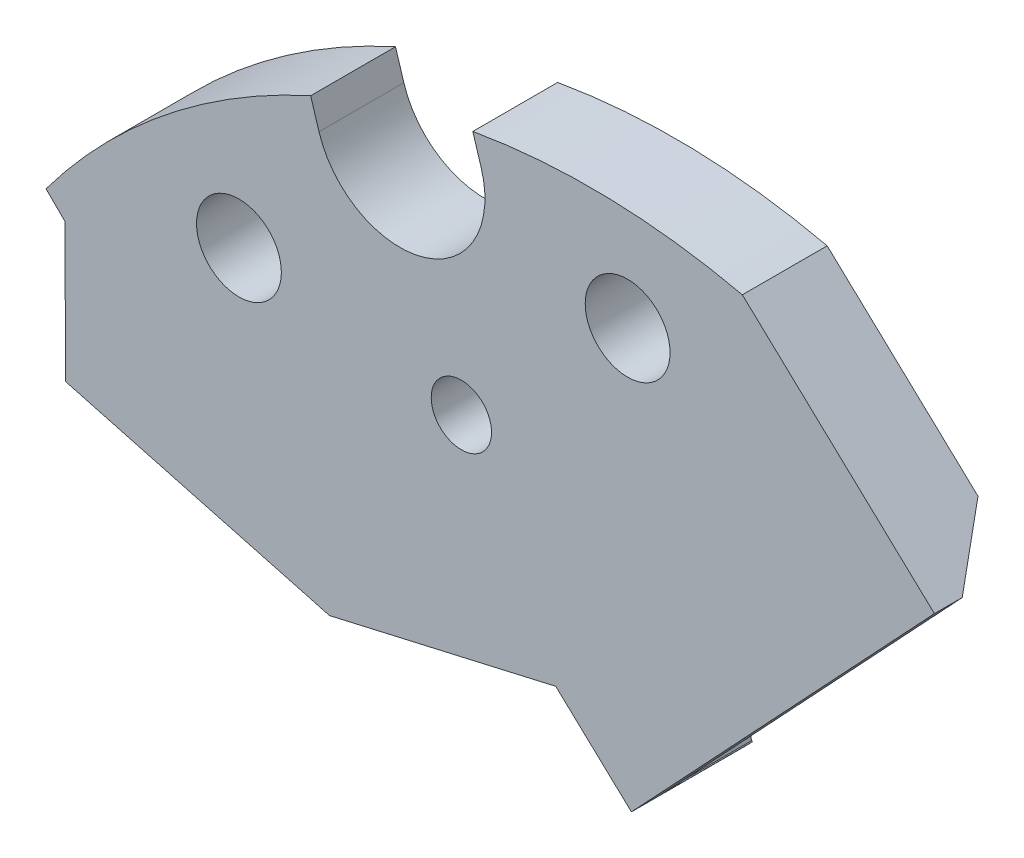
ISO-10303-21;
HEADER;
FILE_DESCRIPTION(('STEP AP214'),'2;1');
FILE_NAME('part.step','',(''),(''),'','','');
FILE_SCHEMA(('AUTOMOTIVE_DESIGN { 1 0 10303 214 1 1 1 1 }'));
ENDSEC;
DATA;
#1=APPLICATION_CONTEXT('core data for automotive mechanical design processes');
#2=APPLICATION_PROTOCOL_DEFINITION('international standard','automotive_design',2000,#1);
#3=PRODUCT_CONTEXT('',#1,'mechanical');
#4=PRODUCT('Part','Part','',(#3));
#5=PRODUCT_RELATED_PRODUCT_CATEGORY('part','',(#4));
#6=PRODUCT_DEFINITION_FORMATION('','',#4);
#7=PRODUCT_DEFINITION_CONTEXT('part definition',#1,'design');
#8=PRODUCT_DEFINITION('design','',#6,#7);
#9=PRODUCT_DEFINITION_SHAPE('','',#8);
#10=(LENGTH_UNIT() NAMED_UNIT(*) SI_UNIT(.MILLI.,.METRE.));
#11=(NAMED_UNIT(*) PLANE_ANGLE_UNIT() SI_UNIT($,.RADIAN.));
#12=(NAMED_UNIT(*) SI_UNIT($,.STERADIAN.) SOLID_ANGLE_UNIT());
#13=UNCERTAINTY_MEASURE_WITH_UNIT(LENGTH_MEASURE(1.E-05),#10,'distance_accuracy_value','');
#14=(GEOMETRIC_REPRESENTATION_CONTEXT(3) GLOBAL_UNCERTAINTY_ASSIGNED_CONTEXT((#13)) GLOBAL_UNIT_ASSIGNED_CONTEXT((#10,
#11,#12)) REPRESENTATION_CONTEXT('',''));
#15=CARTESIAN_POINT('',(0.,0.,0.));
#16=DIRECTION('',(0.,0.,1.));
#17=DIRECTION('',(1.,0.,0.));
#18=AXIS2_PLACEMENT_3D('',#15,#16,#17);
#19=CARTESIAN_POINT('',(0.,0.,0.));
#20=DIRECTION('',(0.,0.,1.));
#21=DIRECTION('',(1.,0.,0.));
#22=AXIS2_PLACEMENT_3D('',#19,#20,#21);
#23=PLANE('',#22);
#24=CARTESIAN_POINT('',(-37.2567306277094,26.8924920595849,0.));
#25=DIRECTION('',(0.,0.,-1.));
#26=DIRECTION('',(-1.,0.,0.));
#27=AXIS2_PLACEMENT_3D('',#24,#25,#26);
#28=CIRCLE('',#27,4.5);
#29=CARTESIAN_POINT('',(-41.7567306277094,26.8924920595849,0.));
#30=VERTEX_POINT('',#29);
#31=EDGE_CURVE('E867',#30,#30,#28,.T.);
#32=ORIENTED_EDGE('',*,*,#31,.F.);
#33=EDGE_LOOP('',(#32));
#34=FACE_BOUND('',#33,.T.);
#35=CARTESIAN_POINT('',(3.97597776256356,40.1359452465193,0.));
#36=DIRECTION('',(0.,0.,-1.));
#37=DIRECTION('',(-1.,0.,0.));
#38=AXIS2_PLACEMENT_3D('',#35,#36,#37);
#39=CIRCLE('',#38,4.5);
#40=CARTESIAN_POINT('',(-0.524022237436443,40.1359452465193,0.));
#41=VERTEX_POINT('',#40);
#42=EDGE_CURVE('E869',#41,#41,#39,.T.);
#43=ORIENTED_EDGE('',*,*,#42,.F.);
#44=EDGE_LOOP('',(#43));
#45=FACE_BOUND('',#44,.T.);
#46=CARTESIAN_POINT('',(-13.6596234424445,23.3458270176943,0.));
#47=DIRECTION('',(0.,0.,-1.));
#48=DIRECTION('',(-1.,0.,0.));
#49=AXIS2_PLACEMENT_3D('',#46,#47,#48);
#50=CIRCLE('',#49,3.2);
#51=CARTESIAN_POINT('',(-16.8596234424445,23.3458270176943,0.));
#52=VERTEX_POINT('',#51);
#53=EDGE_CURVE('E873',#52,#52,#50,.T.);
#54=ORIENTED_EDGE('',*,*,#53,.F.);
#55=EDGE_LOOP('',(#54));
#56=FACE_BOUND('',#55,.T.);
#57=DIRECTION('',(0.965948051503245,-0.258736085224084,0.));
#58=VECTOR('',#57,1.);
#59=CARTESIAN_POINT('',(-55.6666655450204,9.56579888574542,0.));
#60=LINE('',#59,#58);
#61=CARTESIAN_POINT('',(-55.6666655450204,9.56579888574542,0.));
#62=VERTEX_POINT('',#61);
#63=CARTESIAN_POINT('',(-27.6866470689509,2.07115107965537,0.));
#64=VERTEX_POINT('',#63);
#65=EDGE_CURVE('E483',#62,#64,#60,.T.);
#66=ORIENTED_EDGE('',*,*,#65,.F.);
#67=DIRECTION('',(-0.00457764077123991,0.999989522547596,0.));
#68=VECTOR('',#67,1.);
#69=CARTESIAN_POINT('',(-55.62171072926,-0.254618878557554,0.));
#70=LINE('',#69,#68);
#71=CARTESIAN_POINT('',(-55.7148975252944,20.102116027256,0.));
#72=VERTEX_POINT('',#71);
#73=EDGE_CURVE('E236',#62,#72,#70,.T.);
#74=ORIENTED_EDGE('',*,*,#73,.T.);
#75=DIRECTION('',(-0.710336253340082,0.703862491677725,0.));
#76=VECTOR('',#75,1.);
#77=CARTESIAN_POINT('',(-17.5517718704618,-17.7132039529848,0.));
#78=LINE('',#77,#76);
#79=CARTESIAN_POINT('',(-57.7240529027619,22.0929606497885,0.));
#80=VERTEX_POINT('',#79);
#81=EDGE_CURVE('E242',#72,#80,#78,.T.);
#82=ORIENTED_EDGE('',*,*,#81,.T.);
#83=CARTESIAN_POINT('',(0.0894601787075855,-21.0216916099757,0.));
#84=DIRECTION('',(0.,0.,1.));
#85=DIRECTION('',(1.,0.,0.));
#86=AXIS2_PLACEMENT_3D('',#83,#84,#85);
#87=CIRCLE('',#86,72.1198692060768);
#88=CARTESIAN_POINT('',(-29.6476860207004,44.6820196262753,0.));
#89=VERTEX_POINT('',#88);
#90=EDGE_CURVE('E361',#89,#80,#87,.T.);
#91=ORIENTED_EDGE('',*,*,#90,.F.);
#92=DIRECTION('',(0.295393530205696,-0.955375665543464,0.));
#93=VECTOR('',#92,1.);
#94=CARTESIAN_POINT('',(-14.4509151072734,-4.46809248151833,0.));
#95=LINE('',#94,#93);
#96=CARTESIAN_POINT('',(-28.7620060133918,41.8175116397537,0.));
#97=VERTEX_POINT('',#96);
#98=EDGE_CURVE('E357',#89,#97,#95,.T.);
#99=ORIENTED_EDGE('',*,*,#98,.T.);
#100=CARTESIAN_POINT('',(-20.1620060133918,44.4765539949135,0.));
#101=DIRECTION('',(0.,0.,1.));
#102=DIRECTION('',(1.,0.,0.));
#103=AXIS2_PLACEMENT_3D('',#100,#101,#102);
#104=CIRCLE('',#103,9.00169463193089);
#105=CARTESIAN_POINT('',(-11.5620060133918,47.1355963500732,0.));
#106=VERTEX_POINT('',#105);
#107=EDGE_CURVE('E353',#97,#106,#104,.T.);
#108=ORIENTED_EDGE('',*,*,#107,.T.);
#109=DIRECTION('',(0.295393530205696,-0.955375665543464,0.));
#110=VECTOR('',#109,1.);
#111=CARTESIAN_POINT('',(2.74908489272658,0.84999222880113,0.));
#112=LINE('',#111,#110);
#113=CARTESIAN_POINT('',(-12.4476860207004,50.0001043365948,0.));
#114=VERTEX_POINT('',#113);
#115=EDGE_CURVE('E324',#114,#106,#112,.T.);
#116=ORIENTED_EDGE('',*,*,#115,.F.);
#117=CARTESIAN_POINT('',(16.1452330574226,49.2882485945839,0.));
#118=VERTEX_POINT('',#117);
#119=EDGE_CURVE('E240',#118,#114,#87,.T.);
#120=ORIENTED_EDGE('',*,*,#119,.F.);
#121=DIRECTION('',(-0.729537204140085,0.68394112888133,0.));
#122=VECTOR('',#121,1.);
#123=CARTESIAN_POINT('',(32.1452330574225,34.288248594584,0.));
#124=LINE('',#123,#122);
#125=CARTESIAN_POINT('',(32.1452330574226,34.2882485945839,0.));
#126=VERTEX_POINT('',#125);
#127=EDGE_CURVE('E233',#126,#118,#124,.T.);
#128=ORIENTED_EDGE('',*,*,#127,.F.);
#129=DIRECTION('',(0.683941128881333,0.729537204140082,0.));
#130=VECTOR('',#129,1.);
#131=CARTESIAN_POINT('',(0.,0.,0.));
#132=LINE('',#131,#130);
#133=CARTESIAN_POINT('',(2.73576451552533,2.91814881656033,0.));
#134=VERTEX_POINT('',#133);
#135=EDGE_CURVE('E212',#134,#126,#132,.T.);
#136=ORIENTED_EDGE('',*,*,#135,.F.);
#137=DIRECTION('',(0.729537204140082,-0.683941128881333,0.));
#138=VECTOR('',#137,1.);
#139=CARTESIAN_POINT('',(-2.46548262145729,7.79431800748158,0.));
#140=LINE('',#139,#138);
#141=CARTESIAN_POINT('',(-2.46548262145729,7.79431800748158,0.));
#142=VERTEX_POINT('',#141);
#143=EDGE_CURVE('E222',#142,#134,#140,.T.);
#144=ORIENTED_EDGE('',*,*,#143,.F.);
#145=DIRECTION('',(0.974732318528274,0.223376156329396,0.));
#146=VECTOR('',#145,1.);
#147=CARTESIAN_POINT('',(-15.1370027623248,4.89042797519943,0.));
#148=LINE('',#147,#146);
#149=CARTESIAN_POINT('',(-15.1370027623248,4.89042797519943,0.));
#150=VERTEX_POINT('',#149);
#151=EDGE_CURVE('E229',#150,#142,#148,.T.);
#152=ORIENTED_EDGE('',*,*,#151,.F.);
#153=DIRECTION('',(0.975682846238907,0.219187097145668,0.));
#154=VECTOR('',#153,1.);
#155=CARTESIAN_POINT('',(-27.6866470689509,2.07115107965537,0.));
#156=LINE('',#155,#154);
#157=EDGE_CURVE('E487',#64,#150,#156,.T.);
#158=ORIENTED_EDGE('',*,*,#157,.F.);
#159=EDGE_LOOP('',(#66,#74,#82,#91,#99,#108,#116,#120,#128,#136,#144,#152,#158));
#160=FACE_BOUND('',#159,.T.);
#161=ADVANCED_FACE('F57',(#34,#45,#56,#160),#23,.F.);
#162=CARTESIAN_POINT('',(0.,0.,0.));
#163=DIRECTION('',(0.51801458282136,-0.485638671395029,-0.70414201183432));
#164=DIRECTION('',(-0.805507343825871,0.,-0.592585790449442));
#165=AXIS2_PLACEMENT_3D('',#162,#163,#164);
#166=PLANE('',#165);
#167=DIRECTION('',(0.513697794631182,-0.481591682466737,0.710059171597633));
#168=VECTOR('',#167,1.);
#169=CARTESIAN_POINT('',(0.341970564440665,0.36476860207004,0.));
#170=LINE('',#169,#168);
#171=CARTESIAN_POINT('',(4.64624006886715,-3.67048405832982,5.94957983193277));
#172=VERTEX_POINT('',#171);
#173=CARTESIAN_POINT('',(4.68271692907415,-3.70468111477389,6.));
#174=VERTEX_POINT('',#173);
#175=EDGE_CURVE('E216',#172,#174,#170,.T.);
#176=ORIENTED_EDGE('',*,*,#175,.F.);
#177=DIRECTION('',(-0.210390634121723,0.725571518629823,-0.655195964904449));
#178=VECTOR('',#177,1.);
#179=CARTESIAN_POINT('',(4.64624006886715,-3.67048405832982,5.94957983193277));
#180=LINE('',#179,#178);
#181=EDGE_CURVE('E95',#172,#134,#180,.T.);
#182=ORIENTED_EDGE('',*,*,#181,.T.);
#183=ORIENTED_EDGE('',*,*,#135,.T.);
#184=DIRECTION('',(-0.513697794631183,0.481591682466737,-0.710059171597633));
#185=VECTOR('',#184,1.);
#186=CARTESIAN_POINT('',(36.4859794220561,30.2187988777399,6.));
#187=LINE('',#186,#185);
#188=CARTESIAN_POINT('',(36.4859794220561,30.2187988777399,6.));
#189=VERTEX_POINT('',#188);
#190=EDGE_CURVE('E311',#189,#126,#187,.T.);
#191=ORIENTED_EDGE('',*,*,#190,.F.);
#192=DIRECTION('',(-0.683941128881333,-0.729537204140082,0.));
#193=VECTOR('',#192,1.);
#194=CARTESIAN_POINT('',(36.4859794220561,30.2187988777399,6.));
#195=LINE('',#194,#193);
#196=EDGE_CURVE('E308',#189,#174,#195,.T.);
#197=ORIENTED_EDGE('',*,*,#196,.T.);
#198=EDGE_LOOP('',(#176,#182,#183,#191,#197));
#199=FACE_BOUND('',#198,.T.);
#200=ADVANCED_FACE('F209',(#199),#166,.T.);
#201=CARTESIAN_POINT('',(-20.1620060133918,44.4765539949135,9.));
#202=DIRECTION('',(0.,0.,-1.));
#203=DIRECTION('',(-1.,0.,0.));
#204=AXIS2_PLACEMENT_3D('',#201,#202,#203);
#205=CYLINDRICAL_SURFACE('',#204,9.00169463193089);
#206=ORIENTED_EDGE('',*,*,#107,.F.);
#207=DIRECTION('',(0.,0.,-1.));
#208=VECTOR('',#207,1.);
#209=CARTESIAN_POINT('',(-28.7620060133918,41.8175116397537,9.));
#210=LINE('',#209,#208);
#211=CARTESIAN_POINT('',(-28.7620060133918,41.8175116397537,9.));
#212=VERTEX_POINT('',#211);
#213=EDGE_CURVE('E68',#212,#97,#210,.T.);
#214=ORIENTED_EDGE('',*,*,#213,.F.);
#215=CARTESIAN_POINT('',(-20.1620060133918,44.4765539949135,9.));
#216=DIRECTION('',(0.,0.,1.));
#217=DIRECTION('',(1.,0.,0.));
#218=AXIS2_PLACEMENT_3D('',#215,#216,#217);
#219=CIRCLE('',#218,9.00169463193089);
#220=CARTESIAN_POINT('',(-11.5620060133918,47.1355963500732,9.));
#221=VERTEX_POINT('',#220);
#222=EDGE_CURVE('E319',#212,#221,#219,.T.);
#223=ORIENTED_EDGE('',*,*,#222,.T.);
#224=DIRECTION('',(0.,0.,-1.));
#225=VECTOR('',#224,1.);
#226=CARTESIAN_POINT('',(-11.5620060133918,47.1355963500732,9.));
#227=LINE('',#226,#225);
#228=EDGE_CURVE('E352',#221,#106,#227,.T.);
#229=ORIENTED_EDGE('',*,*,#228,.T.);
#230=EDGE_LOOP('',(#206,#214,#223,#229));
#231=FACE_BOUND('',#230,.T.);
#232=ADVANCED_FACE('F59',(#231),#205,.F.);
#233=CARTESIAN_POINT('',(-14.4509151072734,-4.46809248151833,9.));
#234=DIRECTION('',(0.955375665543464,0.295393530205696,0.));
#235=DIRECTION('',(-0.295393530205696,0.955375665543464,0.));
#236=AXIS2_PLACEMENT_3D('',#233,#234,#235);
#237=PLANE('',#236);
#238=ORIENTED_EDGE('',*,*,#98,.F.);
#239=DIRECTION('',(0.,0.,-1.));
#240=VECTOR('',#239,1.);
#241=CARTESIAN_POINT('',(-29.6476860207004,44.6820196262753,9.));
#242=LINE('',#241,#240);
#243=CARTESIAN_POINT('',(-29.6476860207004,44.6820196262753,9.));
#244=VERTEX_POINT('',#243);
#245=EDGE_CURVE('E399',#244,#89,#242,.T.);
#246=ORIENTED_EDGE('',*,*,#245,.F.);
#247=DIRECTION('',(0.295393530205696,-0.955375665543464,0.));
#248=VECTOR('',#247,1.);
#249=CARTESIAN_POINT('',(-14.4509151072734,-4.46809248151833,9.));
#250=LINE('',#249,#248);
#251=EDGE_CURVE('E323',#244,#212,#250,.T.);
#252=ORIENTED_EDGE('',*,*,#251,.T.);
#253=ORIENTED_EDGE('',*,*,#213,.T.);
#254=EDGE_LOOP('',(#238,#246,#252,#253));
#255=FACE_BOUND('',#254,.T.);
#256=ADVANCED_FACE('F433',(#255),#237,.T.);
#257=CARTESIAN_POINT('',(0.0894601787075855,-21.0216916099757,9.));
#258=DIRECTION('',(0.,0.,-1.));
#259=DIRECTION('',(-1.,0.,0.));
#260=AXIS2_PLACEMENT_3D('',#257,#258,#259);
#261=CYLINDRICAL_SURFACE('',#260,72.1198692060768);
#262=ORIENTED_EDGE('',*,*,#90,.T.);
#263=DIRECTION('',(0.,0.,-1.));
#264=VECTOR('',#263,1.);
#265=CARTESIAN_POINT('',(-57.7240529027619,22.0929606497885,9.));
#266=LINE('',#265,#264);
#267=CARTESIAN_POINT('',(-57.7240529027619,22.0929606497885,9.));
#268=VERTEX_POINT('',#267);
#269=EDGE_CURVE('E396',#268,#80,#266,.T.);
#270=ORIENTED_EDGE('',*,*,#269,.F.);
#271=CARTESIAN_POINT('',(0.0894601787075855,-21.0216916099757,9.));
#272=DIRECTION('',(0.,0.,1.));
#273=DIRECTION('',(1.,0.,0.));
#274=AXIS2_PLACEMENT_3D('',#271,#272,#273);
#275=CIRCLE('',#274,72.1198692060768);
#276=EDGE_CURVE('E328',#244,#268,#275,.T.);
#277=ORIENTED_EDGE('',*,*,#276,.F.);
#278=ORIENTED_EDGE('',*,*,#245,.T.);
#279=EDGE_LOOP('',(#262,#270,#277,#278));
#280=FACE_BOUND('',#279,.T.);
#281=ADVANCED_FACE('F438',(#280),#261,.T.);
#282=CARTESIAN_POINT('',(-17.5517718704618,-17.7132039529848,9.));
#283=DIRECTION('',(-0.703862491677725,-0.710336253340082,0.));
#284=DIRECTION('',(0.710336253340082,-0.703862491677725,0.));
#285=AXIS2_PLACEMENT_3D('',#282,#283,#284);
#286=PLANE('',#285);
#287=ORIENTED_EDGE('',*,*,#81,.F.);
#288=DIRECTION('',(0.,0.,-1.));
#289=VECTOR('',#288,1.);
#290=CARTESIAN_POINT('',(-55.7148975252944,20.102116027256,9.));
#291=LINE('',#290,#289);
#292=CARTESIAN_POINT('',(-55.7148975252944,20.102116027256,9.));
#293=VERTEX_POINT('',#292);
#294=EDGE_CURVE('E392',#293,#72,#291,.T.);
#295=ORIENTED_EDGE('',*,*,#294,.F.);
#296=DIRECTION('',(-0.710336253340082,0.703862491677725,0.));
#297=VECTOR('',#296,1.);
#298=CARTESIAN_POINT('',(-17.5517718704618,-17.7132039529848,9.));
#299=LINE('',#298,#297);
#300=EDGE_CURVE('E331',#293,#268,#299,.T.);
#301=ORIENTED_EDGE('',*,*,#300,.T.);
#302=ORIENTED_EDGE('',*,*,#269,.T.);
#303=EDGE_LOOP('',(#287,#295,#301,#302));
#304=FACE_BOUND('',#303,.T.);
#305=ADVANCED_FACE('F580',(#304),#286,.T.);
#306=CARTESIAN_POINT('',(-55.62171072926,-0.254618878557554,9.));
#307=DIRECTION('',(-0.999989522547596,-0.00457764077123991,0.));
#308=DIRECTION('',(0.00457764077123991,-0.999989522547596,0.));
#309=AXIS2_PLACEMENT_3D('',#306,#307,#308);
#310=PLANE('',#309);
#311=ORIENTED_EDGE('',*,*,#73,.F.);
#312=DIRECTION('',(0.,0.,1.));
#313=VECTOR('',#312,1.);
#314=CARTESIAN_POINT('',(-55.6666655450204,9.56579888574542,-24.));
#315=LINE('',#314,#313);
#316=CARTESIAN_POINT('',(-55.6666655450204,9.56579888574542,-24.));
#317=VERTEX_POINT('',#316);
#318=EDGE_CURVE('E497',#317,#62,#315,.T.);
#319=ORIENTED_EDGE('',*,*,#318,.F.);
#320=DIRECTION('',(-0.00457764077124022,0.999989522547596,0.));
#321=VECTOR('',#320,1.);
#322=CARTESIAN_POINT('',(-55.6476860207004,5.41970564440665,-24.));
#323=LINE('',#322,#321);
#324=CARTESIAN_POINT('',(-55.6476860207004,5.41970564440665,-24.));
#325=VERTEX_POINT('',#324);
#326=EDGE_CURVE('E451',#325,#317,#323,.T.);
#327=ORIENTED_EDGE('',*,*,#326,.F.);
#328=DIRECTION('',(0.,0.,-1.));
#329=VECTOR('',#328,1.);
#330=CARTESIAN_POINT('',(-55.6476860207004,5.41970564440665,9.));
#331=LINE('',#330,#329);
#332=CARTESIAN_POINT('',(-55.6476860207004,5.41970564440665,9.));
#333=VERTEX_POINT('',#332);
#334=EDGE_CURVE('E388',#333,#325,#331,.T.);
#335=ORIENTED_EDGE('',*,*,#334,.F.);
#336=DIRECTION('',(-0.00457764077123991,0.999989522547596,0.));
#337=VECTOR('',#336,1.);
#338=CARTESIAN_POINT('',(-55.62171072926,-0.254618878557554,9.));
#339=LINE('',#338,#337);
#340=EDGE_CURVE('E336',#333,#293,#339,.T.);
#341=ORIENTED_EDGE('',*,*,#340,.T.);
#342=ORIENTED_EDGE('',*,*,#294,.T.);
#343=EDGE_LOOP('',(#311,#319,#327,#335,#341,#342));
#344=FACE_BOUND('',#343,.T.);
#345=ADVANCED_FACE('F445',(#344),#310,.T.);
#346=CARTESIAN_POINT('',(-2.37077554696698,-8.85089537534339,9.));
#347=DIRECTION('',(-0.258736085224084,-0.965948051503245,0.));
#348=DIRECTION('',(0.965948051503245,-0.258736085224084,0.));
#349=AXIS2_PLACEMENT_3D('',#346,#347,#348);
#350=PLANE('',#349);
#351=ORIENTED_EDGE('',*,*,#334,.T.);
#352=DIRECTION('',(-0.965948051503245,0.258736085224084,0.));
#353=VECTOR('',#352,1.);
#354=CARTESIAN_POINT('',(-27.6476860207004,-2.08029435559336,-24.));
#355=LINE('',#354,#353);
#356=CARTESIAN_POINT('',(-27.6476860207004,-2.08029435559336,-24.));
#357=VERTEX_POINT('',#356);
#358=EDGE_CURVE('E457',#357,#325,#355,.T.);
#359=ORIENTED_EDGE('',*,*,#358,.F.);
#360=DIRECTION('',(0.,0.,-1.));
#361=VECTOR('',#360,1.);
#362=CARTESIAN_POINT('',(-27.6476860207004,-2.08029435559336,9.));
#363=LINE('',#362,#361);
#364=CARTESIAN_POINT('',(-27.6476860207004,-2.08029435559336,9.));
#365=VERTEX_POINT('',#364);
#366=EDGE_CURVE('E384',#365,#357,#363,.T.);
#367=ORIENTED_EDGE('',*,*,#366,.F.);
#368=DIRECTION('',(-0.965948051503245,0.258736085224084,0.));
#369=VECTOR('',#368,1.);
#370=CARTESIAN_POINT('',(-2.37077554696698,-8.85089537534339,9.));
#371=LINE('',#370,#369);
#372=EDGE_CURVE('E340',#365,#333,#371,.T.);
#373=ORIENTED_EDGE('',*,*,#372,.T.);
#374=EDGE_LOOP('',(#351,#359,#367,#373));
#375=FACE_BOUND('',#374,.T.);
#376=ADVANCED_FACE('F455',(#375),#350,.T.);
#377=CARTESIAN_POINT('',(-0.926587459278955,4.04329073139907,9.));
#378=DIRECTION('',(0.223376156329396,-0.974732318528274,0.));
#379=DIRECTION('',(0.974732318528274,0.223376156329396,0.));
#380=AXIS2_PLACEMENT_3D('',#377,#378,#379);
#381=PLANE('',#380);
#382=ORIENTED_EDGE('',*,*,#366,.T.);
#383=DIRECTION('',(-0.974732318528274,-0.223376156329396,0.));
#384=VECTOR('',#383,1.);
#385=CARTESIAN_POINT('',(-14.2434981370073,0.99149870108633,-24.));
#386=LINE('',#385,#384);
#387=CARTESIAN_POINT('',(-14.2434981370073,0.99149870108633,-24.));
#388=VERTEX_POINT('',#387);
#389=EDGE_CURVE('E466',#388,#357,#386,.T.);
#390=ORIENTED_EDGE('',*,*,#389,.F.);
#391=DIRECTION('',(0.,0.,1.));
#392=VECTOR('',#391,1.);
#393=CARTESIAN_POINT('',(-14.2434981370073,0.99149870108633,-24.));
#394=LINE('',#393,#392);
#395=CARTESIAN_POINT('',(-14.2434981370073,0.99149870108633,-3.5));
#396=VERTEX_POINT('',#395);
#397=EDGE_CURVE('E501',#388,#396,#394,.T.);
#398=ORIENTED_EDGE('',*,*,#397,.T.);
#399=DIRECTION('',(-0.974732318528274,-0.223376156329396,0.));
#400=VECTOR('',#399,1.);
#401=CARTESIAN_POINT('',(-3.64768602070043,3.41970564440665,-3.5));
#402=LINE('',#401,#400);
#403=CARTESIAN_POINT('',(-3.64768602070043,3.41970564440665,-3.5));
#404=VERTEX_POINT('',#403);
#405=EDGE_CURVE('E255',#404,#396,#402,.T.);
#406=ORIENTED_EDGE('',*,*,#405,.F.);
#407=DIRECTION('',(0.,0.,-1.));
#408=VECTOR('',#407,1.);
#409=CARTESIAN_POINT('',(-3.64768602070043,3.41970564440665,9.));
#410=LINE('',#409,#408);
#411=CARTESIAN_POINT('',(-3.64768602070043,3.41970564440665,9.));
#412=VERTEX_POINT('',#411);
#413=EDGE_CURVE('E381',#412,#404,#410,.T.);
#414=ORIENTED_EDGE('',*,*,#413,.F.);
#415=DIRECTION('',(-0.974732318528274,-0.223376156329396,0.));
#416=VECTOR('',#415,1.);
#417=CARTESIAN_POINT('',(-0.926587459278955,4.04329073139907,9.));
#418=LINE('',#417,#416);
#419=EDGE_CURVE('E344',#412,#365,#418,.T.);
#420=ORIENTED_EDGE('',*,*,#419,.T.);
#421=EDGE_LOOP('',(#382,#390,#398,#406,#414,#420));
#422=FACE_BOUND('',#421,.T.);
#423=ADVANCED_FACE('F571',(#422),#381,.T.);
#424=CARTESIAN_POINT('',(0.,0.,9.));
#425=DIRECTION('',(-0.68394112888133,-0.729537204140085,0.));
#426=DIRECTION('',(0.729537204140085,-0.68394112888133,0.));
#427=AXIS2_PLACEMENT_3D('',#424,#425,#426);
#428=PLANE('',#427);
#429=DIRECTION('',(-0.729537204140085,0.68394112888133,0.));
#430=VECTOR('',#429,1.);
#431=CARTESIAN_POINT('',(0.,0.,-3.5));
#432=LINE('',#431,#430);
#433=CARTESIAN_POINT('',(4.37722322484049,-4.10364677328799,-3.5));
#434=VERTEX_POINT('',#433);
#435=EDGE_CURVE('E228',#434,#404,#432,.T.);
#436=ORIENTED_EDGE('',*,*,#435,.F.);
#437=DIRECTION('',(0.,0.,1.));
#438=VECTOR('',#437,1.);
#439=CARTESIAN_POINT('',(4.3772232248405,-4.10364677328799,6.));
#440=LINE('',#439,#438);
#441=CARTESIAN_POINT('',(4.3772232248405,-4.10364677328799,9.));
#442=VERTEX_POINT('',#441);
#443=EDGE_CURVE('E303',#434,#442,#440,.T.);
#444=ORIENTED_EDGE('',*,*,#443,.T.);
#445=DIRECTION('',(-0.729537204140085,0.68394112888133,0.));
#446=VECTOR('',#445,1.);
#447=CARTESIAN_POINT('',(0.,0.,9.));
#448=LINE('',#447,#446);
#449=EDGE_CURVE('E348',#442,#412,#448,.T.);
#450=ORIENTED_EDGE('',*,*,#449,.T.);
#451=ORIENTED_EDGE('',*,*,#413,.T.);
#452=EDGE_LOOP('',(#436,#444,#450,#451));
#453=FACE_BOUND('',#452,.T.);
#454=ADVANCED_FACE('F574',(#453),#428,.T.);
#455=CARTESIAN_POINT('',(32.1452330574225,34.288248594584,9.));
#456=DIRECTION('',(-0.68394112888133,-0.729537204140085,0.));
#457=DIRECTION('',(0.729537204140085,-0.68394112888133,0.));
#458=AXIS2_PLACEMENT_3D('',#455,#456,#457);
#459=PLANE('',#458);
#460=ORIENTED_EDGE('',*,*,#127,.T.);
#461=DIRECTION('',(0.,0.,-1.));
#462=VECTOR('',#461,1.);
#463=CARTESIAN_POINT('',(16.1452330574226,49.2882485945839,9.));
#464=LINE('',#463,#462);
#465=CARTESIAN_POINT('',(16.1452330574226,49.2882485945839,9.));
#466=VERTEX_POINT('',#465);
#467=EDGE_CURVE('E377',#466,#118,#464,.T.);
#468=ORIENTED_EDGE('',*,*,#467,.F.);
#469=DIRECTION('',(-0.729537204140085,0.68394112888133,0.));
#470=VECTOR('',#469,1.);
#471=CARTESIAN_POINT('',(32.1452330574225,34.288248594584,9.));
#472=LINE('',#471,#470);
#473=CARTESIAN_POINT('',(36.5224562822631,30.1846018212959,9.));
#474=VERTEX_POINT('',#473);
#475=EDGE_CURVE('E407',#474,#466,#472,.T.);
#476=ORIENTED_EDGE('',*,*,#475,.F.);
#477=DIRECTION('',(0.,0.,1.));
#478=VECTOR('',#477,1.);
#479=CARTESIAN_POINT('',(36.5224562822631,30.1846018212959,6.));
#480=LINE('',#479,#478);
#481=CARTESIAN_POINT('',(36.5224562822631,30.1846018212959,6.));
#482=VERTEX_POINT('',#481);
#483=EDGE_CURVE('E312',#482,#474,#480,.T.);
#484=ORIENTED_EDGE('',*,*,#483,.F.);
#485=DIRECTION('',(0.729537204140063,-0.683941128881353,0.));
#486=VECTOR('',#485,1.);
#487=CARTESIAN_POINT('',(36.4859794220561,30.2187988777399,6.));
#488=LINE('',#487,#486);
#489=EDGE_CURVE('E295',#189,#482,#488,.T.);
#490=ORIENTED_EDGE('',*,*,#489,.F.);
#491=ORIENTED_EDGE('',*,*,#190,.T.);
#492=EDGE_LOOP('',(#460,#468,#476,#484,#490,#491));
#493=FACE_BOUND('',#492,.T.);
#494=ADVANCED_FACE('F578',(#493),#459,.F.);
#495=ORIENTED_EDGE('',*,*,#119,.T.);
#496=DIRECTION('',(0.,0.,-1.));
#497=VECTOR('',#496,1.);
#498=CARTESIAN_POINT('',(-12.4476860207004,50.0001043365948,9.));
#499=LINE('',#498,#497);
#500=CARTESIAN_POINT('',(-12.4476860207004,50.0001043365948,9.));
#501=VERTEX_POINT('',#500);
#502=EDGE_CURVE('E373',#501,#114,#499,.T.);
#503=ORIENTED_EDGE('',*,*,#502,.F.);
#504=EDGE_CURVE('E332',#466,#501,#275,.T.);
#505=ORIENTED_EDGE('',*,*,#504,.F.);
#506=ORIENTED_EDGE('',*,*,#467,.T.);
#507=EDGE_LOOP('',(#495,#503,#505,#506));
#508=FACE_BOUND('',#507,.T.);
#509=ADVANCED_FACE('F424',(#508),#261,.T.);
#510=CARTESIAN_POINT('',(2.74908489272658,0.84999222880113,9.));
#511=DIRECTION('',(0.955375665543464,0.295393530205696,0.));
#512=DIRECTION('',(-0.295393530205696,0.955375665543464,0.));
#513=AXIS2_PLACEMENT_3D('',#510,#511,#512);
#514=PLANE('',#513);
#515=ORIENTED_EDGE('',*,*,#115,.T.);
#516=ORIENTED_EDGE('',*,*,#228,.F.);
#517=DIRECTION('',(0.295393530205696,-0.955375665543464,0.));
#518=VECTOR('',#517,1.);
#519=CARTESIAN_POINT('',(2.74908489272658,0.84999222880113,9.));
#520=LINE('',#519,#518);
#521=EDGE_CURVE('E349',#501,#221,#520,.T.);
#522=ORIENTED_EDGE('',*,*,#521,.F.);
#523=ORIENTED_EDGE('',*,*,#502,.T.);
#524=EDGE_LOOP('',(#515,#516,#522,#523));
#525=FACE_BOUND('',#524,.T.);
#526=ADVANCED_FACE('F427',(#525),#514,.F.);
#527=CARTESIAN_POINT('',(0.,0.,9.));
#528=DIRECTION('',(0.,0.,1.));
#529=DIRECTION('',(1.,0.,0.));
#530=AXIS2_PLACEMENT_3D('',#527,#528,#529);
#531=PLANE('',#530);
#532=CARTESIAN_POINT('',(-37.2567306277094,26.8924920595849,9.));
#533=DIRECTION('',(0.,0.,1.));
#534=DIRECTION('',(1.,0.,0.));
#535=AXIS2_PLACEMENT_3D('',#532,#533,#534);
#536=CIRCLE('',#535,4.5);
#537=CARTESIAN_POINT('',(-32.7567306277094,26.8924920595849,9.));
#538=VERTEX_POINT('',#537);
#539=EDGE_CURVE('E61',#538,#538,#536,.T.);
#540=ORIENTED_EDGE('',*,*,#539,.F.);
#541=EDGE_LOOP('',(#540));
#542=FACE_BOUND('',#541,.T.);
#543=CARTESIAN_POINT('',(3.97597776256356,40.1359452465193,9.));
#544=DIRECTION('',(0.,0.,1.));
#545=DIRECTION('',(1.,0.,0.));
#546=AXIS2_PLACEMENT_3D('',#543,#544,#545);
#547=CIRCLE('',#546,4.5);
#548=CARTESIAN_POINT('',(8.47597776256355,40.1359452465193,9.));
#549=VERTEX_POINT('',#548);
#550=EDGE_CURVE('E887',#549,#549,#547,.T.);
#551=ORIENTED_EDGE('',*,*,#550,.F.);
#552=EDGE_LOOP('',(#551));
#553=FACE_BOUND('',#552,.T.);
#554=CARTESIAN_POINT('',(-13.6596234424445,23.3458270176943,9.));
#555=DIRECTION('',(0.,0.,1.));
#556=DIRECTION('',(1.,0.,0.));
#557=AXIS2_PLACEMENT_3D('',#554,#555,#556);
#558=CIRCLE('',#557,3.2);
#559=CARTESIAN_POINT('',(-10.4596234424444,23.3458270176943,9.));
#560=VERTEX_POINT('',#559);
#561=EDGE_CURVE('E878',#560,#560,#558,.T.);
#562=ORIENTED_EDGE('',*,*,#561,.F.);
#563=EDGE_LOOP('',(#562));
#564=FACE_BOUND('',#563,.T.);
#565=ORIENTED_EDGE('',*,*,#222,.F.);
#566=ORIENTED_EDGE('',*,*,#251,.F.);
#567=ORIENTED_EDGE('',*,*,#276,.T.);
#568=ORIENTED_EDGE('',*,*,#300,.F.);
#569=ORIENTED_EDGE('',*,*,#340,.F.);
#570=ORIENTED_EDGE('',*,*,#372,.F.);
#571=ORIENTED_EDGE('',*,*,#419,.F.);
#572=ORIENTED_EDGE('',*,*,#449,.F.);
#573=DIRECTION('',(-0.683941128881333,-0.729537204140082,0.));
#574=VECTOR('',#573,1.);
#575=CARTESIAN_POINT('',(36.5224562822631,30.1846018212959,9.));
#576=LINE('',#575,#574);
#577=EDGE_CURVE('E533',#474,#442,#576,.T.);
#578=ORIENTED_EDGE('',*,*,#577,.F.);
#579=ORIENTED_EDGE('',*,*,#475,.T.);
#580=ORIENTED_EDGE('',*,*,#504,.T.);
#581=ORIENTED_EDGE('',*,*,#521,.T.);
#582=EDGE_LOOP('',(#565,#566,#567,#568,#569,#570,#571,#572,#578,#579,#580,#581));
#583=FACE_BOUND('',#582,.T.);
#584=ADVANCED_FACE('F420',(#542,#553,#564,#583),#531,.T.);
#585=CARTESIAN_POINT('',(36.5224562822631,30.1846018212959,6.));
#586=DIRECTION('',(-0.729537204140082,0.683941128881333,0.));
#587=DIRECTION('',(-0.683941128881333,-0.729537204140082,0.));
#588=AXIS2_PLACEMENT_3D('',#585,#586,#587);
#589=PLANE('',#588);
#590=ORIENTED_EDGE('',*,*,#577,.T.);
#591=ORIENTED_EDGE('',*,*,#443,.F.);
#592=DIRECTION('',(0.683941128881333,0.729537204140082,0.));
#593=VECTOR('',#592,1.);
#594=CARTESIAN_POINT('',(4.71919378928116,-3.73887817121795,-3.5));
#595=LINE('',#594,#593);
#596=CARTESIAN_POINT('',(4.71919378928116,-3.73887817121795,-3.5));
#597=VERTEX_POINT('',#596);
#598=EDGE_CURVE('E218',#434,#597,#595,.T.);
#599=ORIENTED_EDGE('',*,*,#598,.T.);
#600=DIRECTION('',(0.,0.,1.));
#601=VECTOR('',#600,1.);
#602=CARTESIAN_POINT('',(4.71919378928116,-3.73887817121795,6.));
#603=LINE('',#602,#601);
#604=CARTESIAN_POINT('',(4.71919378928116,-3.73887817121795,6.));
#605=VERTEX_POINT('',#604);
#606=EDGE_CURVE('E511',#597,#605,#603,.T.);
#607=ORIENTED_EDGE('',*,*,#606,.T.);
#608=DIRECTION('',(-0.683941128881333,-0.729537204140082,0.));
#609=VECTOR('',#608,1.);
#610=CARTESIAN_POINT('',(36.5224562822631,30.1846018212959,6.));
#611=LINE('',#610,#609);
#612=EDGE_CURVE('E77',#482,#605,#611,.T.);
#613=ORIENTED_EDGE('',*,*,#612,.F.);
#614=ORIENTED_EDGE('',*,*,#483,.T.);
#615=EDGE_LOOP('',(#590,#591,#599,#607,#613,#614));
#616=FACE_BOUND('',#615,.T.);
#617=ADVANCED_FACE('F287',(#616),#589,.F.);
#618=CARTESIAN_POINT('',(0.,0.,6.));
#619=DIRECTION('',(0.,0.,-1.));
#620=DIRECTION('',(-1.,0.,0.));
#621=AXIS2_PLACEMENT_3D('',#618,#619,#620);
#622=PLANE('',#621);
#623=DIRECTION('',(0.729537204140082,-0.683941128881333,0.));
#624=VECTOR('',#623,1.);
#625=CARTESIAN_POINT('',(0.341970564440665,0.36476860207004,6.));
#626=LINE('',#625,#624);
#627=EDGE_CURVE('E12',#174,#605,#626,.T.);
#628=ORIENTED_EDGE('',*,*,#627,.F.);
#629=ORIENTED_EDGE('',*,*,#196,.F.);
#630=ORIENTED_EDGE('',*,*,#489,.T.);
#631=ORIENTED_EDGE('',*,*,#612,.T.);
#632=EDGE_LOOP('',(#628,#629,#630,#631));
#633=FACE_BOUND('',#632,.T.);
#634=ADVANCED_FACE('F282',(#633),#622,.T.);
#635=CARTESIAN_POINT('',(-15.1370027623248,4.89042797519943,-3.5));
#636=DIRECTION('',(0.223376156329396,-0.974732318528274,0.));
#637=DIRECTION('',(0.974732318528274,0.223376156329396,0.));
#638=AXIS2_PLACEMENT_3D('',#635,#636,#637);
#639=PLANE('',#638);
#640=ORIENTED_EDGE('',*,*,#151,.T.);
#641=DIRECTION('',(0.,0.,1.));
#642=VECTOR('',#641,1.);
#643=CARTESIAN_POINT('',(-2.46548262145729,7.79431800748158,-3.5));
#644=LINE('',#643,#642);
#645=CARTESIAN_POINT('',(-2.46548262145729,7.79431800748158,-3.5));
#646=VERTEX_POINT('',#645);
#647=EDGE_CURVE('E204',#646,#142,#644,.T.);
#648=ORIENTED_EDGE('',*,*,#647,.F.);
#649=DIRECTION('',(0.974732318528274,0.223376156329396,0.));
#650=VECTOR('',#649,1.);
#651=CARTESIAN_POINT('',(-15.1370027623248,4.89042797519943,-3.5));
#652=LINE('',#651,#650);
#653=CARTESIAN_POINT('',(-15.1370027623248,4.89042797519943,-3.5));
#654=VERTEX_POINT('',#653);
#655=EDGE_CURVE('E260',#654,#646,#652,.T.);
#656=ORIENTED_EDGE('',*,*,#655,.F.);
#657=DIRECTION('',(0.,0.,1.));
#658=VECTOR('',#657,1.);
#659=CARTESIAN_POINT('',(-15.1370027623248,4.89042797519943,-3.5));
#660=LINE('',#659,#658);
#661=EDGE_CURVE('E529',#654,#150,#660,.T.);
#662=ORIENTED_EDGE('',*,*,#661,.T.);
#663=EDGE_LOOP('',(#640,#648,#656,#662));
#664=FACE_BOUND('',#663,.T.);
#665=ADVANCED_FACE('F278',(#664),#639,.F.);
#666=CARTESIAN_POINT('',(-2.46548262145729,7.79431800748158,-3.5));
#667=DIRECTION('',(-0.683941128881333,-0.729537204140082,0.));
#668=DIRECTION('',(0.729537204140082,-0.683941128881333,0.));
#669=AXIS2_PLACEMENT_3D('',#666,#667,#668);
#670=PLANE('',#669);
#671=ORIENTED_EDGE('',*,*,#143,.T.);
#672=CARTESIAN_POINT('',(2.73576451552533,2.91814881656033,-3.5));
#673=DIRECTION('',(0.,0.,1.));
#674=VECTOR('',#673,1.);
#675=LINE('',#672,#674);
#676=CARTESIAN_POINT('',(2.73576451552533,2.91814881656033,-3.5));
#677=VERTEX_POINT('',#676);
#678=EDGE_CURVE('E194',#677,#134,#675,.T.);
#679=ORIENTED_EDGE('',*,*,#678,.F.);
#680=DIRECTION('',(0.729537204140082,-0.683941128881333,0.));
#681=VECTOR('',#680,1.);
#682=CARTESIAN_POINT('',(-2.46548262145729,7.79431800748158,-3.5));
#683=LINE('',#682,#681);
#684=EDGE_CURVE('E205',#646,#677,#683,.T.);
#685=ORIENTED_EDGE('',*,*,#684,.F.);
#686=ORIENTED_EDGE('',*,*,#647,.T.);
#687=EDGE_LOOP('',(#671,#679,#685,#686));
#688=FACE_BOUND('',#687,.T.);
#689=ADVANCED_FACE('F223',(#688),#670,.F.);
#690=CARTESIAN_POINT('',(0.,0.,-3.5));
#691=DIRECTION('',(0.,0.,-1.));
#692=DIRECTION('',(-1.,0.,0.));
#693=AXIS2_PLACEMENT_3D('',#690,#691,#692);
#694=PLANE('',#693);
#695=ORIENTED_EDGE('',*,*,#684,.T.);
#696=DIRECTION('',(-0.278493795044671,0.9604380282567,0.));
#697=VECTOR('',#696,1.);
#698=CARTESIAN_POINT('',(4.64624006886715,-3.67048405832982,-3.5));
#699=LINE('',#698,#697);
#700=CARTESIAN_POINT('',(4.64624006886715,-3.67048405832982,-3.5));
#701=VERTEX_POINT('',#700);
#702=EDGE_CURVE('E197',#701,#677,#699,.T.);
#703=ORIENTED_EDGE('',*,*,#702,.F.);
#704=DIRECTION('',(0.729537204140082,-0.683941128881333,0.));
#705=VECTOR('',#704,1.);
#706=CARTESIAN_POINT('',(4.64624006886715,-3.67048405832982,-3.5));
#707=LINE('',#706,#705);
#708=EDGE_CURVE('E249',#701,#597,#707,.T.);
#709=ORIENTED_EDGE('',*,*,#708,.T.);
#710=ORIENTED_EDGE('',*,*,#598,.F.);
#711=ORIENTED_EDGE('',*,*,#435,.T.);
#712=ORIENTED_EDGE('',*,*,#405,.T.);
#713=DIRECTION('',(-0.223376156329396,0.974732318528274,0.));
#714=VECTOR('',#713,1.);
#715=CARTESIAN_POINT('',(-14.2434981370073,0.99149870108633,-3.5));
#716=LINE('',#715,#714);
#717=EDGE_CURVE('E104',#396,#654,#716,.T.);
#718=ORIENTED_EDGE('',*,*,#717,.T.);
#719=ORIENTED_EDGE('',*,*,#655,.T.);
#720=EDGE_LOOP('',(#695,#703,#709,#710,#711,#712,#718,#719));
#721=FACE_BOUND('',#720,.T.);
#722=ADVANCED_FACE('F277',(#721),#694,.T.);
#723=CARTESIAN_POINT('',(4.64624006886715,-3.67048405832982,6.));
#724=DIRECTION('',(0.683941128881333,0.729537204140082,0.));
#725=DIRECTION('',(-0.729537204140082,0.683941128881333,0.));
#726=AXIS2_PLACEMENT_3D('',#723,#724,#725);
#727=PLANE('',#726);
#728=DIRECTION('',(0.,0.,1.));
#729=VECTOR('',#728,1.);
#730=CARTESIAN_POINT('',(4.64624006886715,-3.67048405832982,6.));
#731=LINE('',#730,#729);
#732=EDGE_CURVE('E88',#701,#172,#731,.T.);
#733=ORIENTED_EDGE('',*,*,#732,.T.);
#734=ORIENTED_EDGE('',*,*,#175,.T.);
#735=ORIENTED_EDGE('',*,*,#627,.T.);
#736=ORIENTED_EDGE('',*,*,#606,.F.);
#737=ORIENTED_EDGE('',*,*,#708,.F.);
#738=EDGE_LOOP('',(#733,#734,#735,#736,#737));
#739=FACE_BOUND('',#738,.T.);
#740=ADVANCED_FACE('F551',(#739),#727,.T.);
#741=CARTESIAN_POINT('',(3.30411678383782,0.95807953801247,0.));
#742=DIRECTION('',(0.9604380282567,0.278493795044671,0.));
#743=DIRECTION('',(-0.278493795044671,0.9604380282567,0.));
#744=AXIS2_PLACEMENT_3D('',#741,#742,#743);
#745=PLANE('',#744);
#746=ORIENTED_EDGE('',*,*,#702,.T.);
#747=ORIENTED_EDGE('',*,*,#678,.T.);
#748=ORIENTED_EDGE('',*,*,#181,.F.);
#749=ORIENTED_EDGE('',*,*,#732,.F.);
#750=EDGE_LOOP('',(#746,#747,#748,#749));
#751=FACE_BOUND('',#750,.T.);
#752=ADVANCED_FACE('F196',(#751),#745,.T.);
#753=CARTESIAN_POINT('',(-15.1370027623248,4.89042797519943,-24.));
#754=DIRECTION('',(-0.974732318528274,-0.223376156329396,0.));
#755=DIRECTION('',(0.223376156329396,-0.974732318528274,0.));
#756=AXIS2_PLACEMENT_3D('',#753,#754,#755);
#757=PLANE('',#756);
#758=ORIENTED_EDGE('',*,*,#717,.F.);
#759=ORIENTED_EDGE('',*,*,#397,.F.);
#760=DIRECTION('',(0.223376156329396,-0.974732318528274,0.));
#761=VECTOR('',#760,1.);
#762=CARTESIAN_POINT('',(-15.1370027623248,4.89042797519943,-24.));
#763=LINE('',#762,#761);
#764=CARTESIAN_POINT('',(-15.1370027623248,4.89042797519943,-24.));
#765=VERTEX_POINT('',#764);
#766=EDGE_CURVE('E473',#765,#388,#763,.T.);
#767=ORIENTED_EDGE('',*,*,#766,.F.);
#768=DIRECTION('',(0.,0.,1.));
#769=VECTOR('',#768,1.);
#770=CARTESIAN_POINT('',(-15.1370027623248,4.89042797519943,-24.));
#771=LINE('',#770,#769);
#772=EDGE_CURVE('E482',#765,#654,#771,.T.);
#773=ORIENTED_EDGE('',*,*,#772,.T.);
#774=EDGE_LOOP('',(#758,#759,#767,#773));
#775=FACE_BOUND('',#774,.T.);
#776=ADVANCED_FACE('F675',(#775),#757,.F.);
#777=CARTESIAN_POINT('',(-55.6666655450204,9.56579888574542,-24.));
#778=DIRECTION('',(-0.258736085224084,-0.965948051503245,0.));
#779=DIRECTION('',(0.965948051503245,-0.258736085224084,0.));
#780=AXIS2_PLACEMENT_3D('',#777,#778,#779);
#781=PLANE('',#780);
#782=ORIENTED_EDGE('',*,*,#65,.T.);
#783=DIRECTION('',(0.,0.,1.));
#784=VECTOR('',#783,1.);
#785=CARTESIAN_POINT('',(-27.6866470689509,2.07115107965537,-24.));
#786=LINE('',#785,#784);
#787=CARTESIAN_POINT('',(-27.6866470689509,2.07115107965537,-24.));
#788=VERTEX_POINT('',#787);
#789=EDGE_CURVE('E493',#788,#64,#786,.T.);
#790=ORIENTED_EDGE('',*,*,#789,.F.);
#791=DIRECTION('',(0.965948051503245,-0.258736085224084,0.));
#792=VECTOR('',#791,1.);
#793=CARTESIAN_POINT('',(-55.6666655450204,9.56579888574542,-24.));
#794=LINE('',#793,#792);
#795=EDGE_CURVE('E471',#317,#788,#794,.T.);
#796=ORIENTED_EDGE('',*,*,#795,.F.);
#797=ORIENTED_EDGE('',*,*,#318,.T.);
#798=EDGE_LOOP('',(#782,#790,#796,#797));
#799=FACE_BOUND('',#798,.T.);
#800=ADVANCED_FACE('F681',(#799),#781,.F.);
#801=CARTESIAN_POINT('',(-27.6866470689509,2.07115107965537,-24.));
#802=DIRECTION('',(0.219187097145668,-0.975682846238907,0.));
#803=DIRECTION('',(0.975682846238907,0.219187097145668,0.));
#804=AXIS2_PLACEMENT_3D('',#801,#802,#803);
#805=PLANE('',#804);
#806=ORIENTED_EDGE('',*,*,#157,.T.);
#807=ORIENTED_EDGE('',*,*,#661,.F.);
#808=ORIENTED_EDGE('',*,*,#772,.F.);
#809=DIRECTION('',(0.975682846238907,0.219187097145668,0.));
#810=VECTOR('',#809,1.);
#811=CARTESIAN_POINT('',(-27.6866470689509,2.07115107965537,-24.));
#812=LINE('',#811,#810);
#813=EDGE_CURVE('E479',#788,#765,#812,.T.);
#814=ORIENTED_EDGE('',*,*,#813,.F.);
#815=ORIENTED_EDGE('',*,*,#789,.T.);
#816=EDGE_LOOP('',(#806,#807,#808,#814,#815));
#817=FACE_BOUND('',#816,.T.);
#818=ADVANCED_FACE('F688',(#817),#805,.F.);
#819=CARTESIAN_POINT('',(0.,0.,-24.));
#820=DIRECTION('',(0.,0.,-1.));
#821=DIRECTION('',(-1.,0.,0.));
#822=AXIS2_PLACEMENT_3D('',#819,#820,#821);
#823=PLANE('',#822);
#824=ORIENTED_EDGE('',*,*,#766,.T.);
#825=ORIENTED_EDGE('',*,*,#389,.T.);
#826=ORIENTED_EDGE('',*,*,#358,.T.);
#827=ORIENTED_EDGE('',*,*,#326,.T.);
#828=ORIENTED_EDGE('',*,*,#795,.T.);
#829=ORIENTED_EDGE('',*,*,#813,.T.);
#830=EDGE_LOOP('',(#824,#825,#826,#827,#828,#829));
#831=FACE_BOUND('',#830,.T.);
#832=ADVANCED_FACE('F463',(#831),#823,.T.);
#833=CARTESIAN_POINT('',(-13.6596234424445,23.3458270176943,21.1808214454858));
#834=DIRECTION('',(0.,0.,-1.));
#835=DIRECTION('',(-1.,0.,0.));
#836=AXIS2_PLACEMENT_3D('',#833,#834,#835);
#837=CYLINDRICAL_SURFACE('',#836,3.2);
#838=ORIENTED_EDGE('',*,*,#561,.T.);
#839=EDGE_LOOP('',(#838));
#840=FACE_BOUND('',#839,.T.);
#841=ORIENTED_EDGE('',*,*,#53,.T.);
#842=EDGE_LOOP('',(#841));
#843=FACE_BOUND('',#842,.T.);
#844=ADVANCED_FACE('F701',(#840,#843),#837,.F.);
#845=CARTESIAN_POINT('',(3.97597776256356,40.1359452465193,21.1808214454858));
#846=DIRECTION('',(0.,0.,-1.));
#847=DIRECTION('',(-1.,0.,0.));
#848=AXIS2_PLACEMENT_3D('',#845,#846,#847);
#849=CYLINDRICAL_SURFACE('',#848,4.5);
#850=ORIENTED_EDGE('',*,*,#550,.T.);
#851=EDGE_LOOP('',(#850));
#852=FACE_BOUND('',#851,.T.);
#853=ORIENTED_EDGE('',*,*,#42,.T.);
#854=EDGE_LOOP('',(#853));
#855=FACE_BOUND('',#854,.T.);
#856=ADVANCED_FACE('F707',(#852,#855),#849,.F.);
#857=CARTESIAN_POINT('',(-37.2567306277094,26.8924920595849,21.1808214454858));
#858=DIRECTION('',(0.,0.,-1.));
#859=DIRECTION('',(-1.,0.,0.));
#860=AXIS2_PLACEMENT_3D('',#857,#858,#859);
#861=CYLINDRICAL_SURFACE('',#860,4.5);
#862=ORIENTED_EDGE('',*,*,#539,.T.);
#863=EDGE_LOOP('',(#862));
#864=FACE_BOUND('',#863,.T.);
#865=ORIENTED_EDGE('',*,*,#31,.T.);
#866=EDGE_LOOP('',(#865));
#867=FACE_BOUND('',#866,.T.);
#868=ADVANCED_FACE('F715',(#864,#867),#861,.F.);
#869=CLOSED_SHELL('',(#161,#200,#232,#256,#281,#305,#345,#376,#423,#454,#494,#509,#526,#584,
#617,#634,#665,#689,#722,#740,#752,#776,#800,#818,#832,#844,#856,#868));
#870=MANIFOLD_SOLID_BREP('B2',#869);
#871=ADVANCED_BREP_SHAPE_REPRESENTATION('',(#18,#870),#14);
#872=SHAPE_DEFINITION_REPRESENTATION(#9,#871);
ENDSEC;
END-ISO-10303-21;
